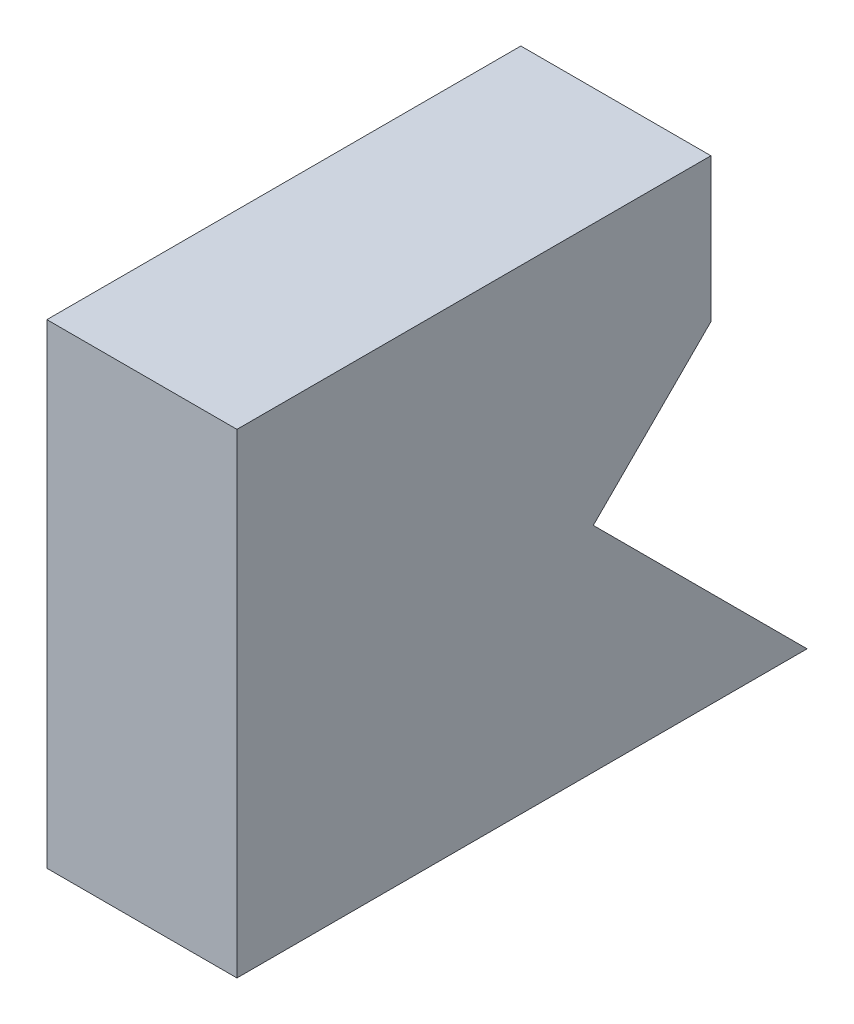
ISO-10303-21;
HEADER;
FILE_DESCRIPTION(('STEP AP214'),'2;1');
FILE_NAME('part.step','',(''),(''),'','','');
FILE_SCHEMA(('AUTOMOTIVE_DESIGN { 1 0 10303 214 1 1 1 1 }'));
ENDSEC;
DATA;
#1=APPLICATION_CONTEXT('core data for automotive mechanical design processes');
#2=APPLICATION_PROTOCOL_DEFINITION('international standard','automotive_design',2000,#1);
#3=PRODUCT_CONTEXT('',#1,'mechanical');
#4=PRODUCT('Part','Part','',(#3));
#5=PRODUCT_RELATED_PRODUCT_CATEGORY('part','',(#4));
#6=PRODUCT_DEFINITION_FORMATION('','',#4);
#7=PRODUCT_DEFINITION_CONTEXT('part definition',#1,'design');
#8=PRODUCT_DEFINITION('design','',#6,#7);
#9=PRODUCT_DEFINITION_SHAPE('','',#8);
#10=(LENGTH_UNIT() NAMED_UNIT(*) SI_UNIT(.MILLI.,.METRE.));
#11=(NAMED_UNIT(*) PLANE_ANGLE_UNIT() SI_UNIT($,.RADIAN.));
#12=(NAMED_UNIT(*) SI_UNIT($,.STERADIAN.) SOLID_ANGLE_UNIT());
#13=UNCERTAINTY_MEASURE_WITH_UNIT(LENGTH_MEASURE(1.E-05),#10,'distance_accuracy_value','');
#14=(GEOMETRIC_REPRESENTATION_CONTEXT(3) GLOBAL_UNCERTAINTY_ASSIGNED_CONTEXT((#13)) GLOBAL_UNIT_ASSIGNED_CONTEXT((#10,
#11,#12)) REPRESENTATION_CONTEXT('',''));
#15=CARTESIAN_POINT('',(0.,0.,0.));
#16=DIRECTION('',(0.,0.,1.));
#17=DIRECTION('',(1.,0.,0.));
#18=AXIS2_PLACEMENT_3D('',#15,#16,#17);
#19=CARTESIAN_POINT('',(40.,44.9999999999995,45.));
#20=DIRECTION('',(0.,-0.707106781186551,0.707106781186544));
#21=DIRECTION('',(0.,-0.707106781186544,-0.707106781186551));
#22=AXIS2_PLACEMENT_3D('',#19,#20,#21);
#23=PLANE('',#22);
#24=DIRECTION('',(0.,0.707106781186543,0.707106781186551));
#25=VECTOR('',#24,1.);
#26=CARTESIAN_POINT('',(0.,44.9999999999995,45.));
#27=LINE('',#26,#25);
#28=CARTESIAN_POINT('',(0.,0.,0.));
#29=VERTEX_POINT('',#28);
#30=CARTESIAN_POINT('',(0.,44.9999999999995,45.));
#31=VERTEX_POINT('',#30);
#32=EDGE_CURVE('E117',#29,#31,#27,.T.);
#33=ORIENTED_EDGE('',*,*,#32,.T.);
#34=DIRECTION('',(-1.,0.,0.));
#35=VECTOR('',#34,1.);
#36=CARTESIAN_POINT('',(40.,44.9999999999995,45.));
#37=LINE('',#36,#35);
#38=CARTESIAN_POINT('',(40.,44.9999999999995,45.));
#39=VERTEX_POINT('',#38);
#40=EDGE_CURVE('E11',#39,#31,#37,.T.);
#41=ORIENTED_EDGE('',*,*,#40,.F.);
#42=DIRECTION('',(0.,0.707106781186543,0.707106781186551));
#43=VECTOR('',#42,1.);
#44=CARTESIAN_POINT('',(40.,44.9999999999995,45.));
#45=LINE('',#44,#43);
#46=CARTESIAN_POINT('',(40.,0.,0.));
#47=VERTEX_POINT('',#46);
#48=EDGE_CURVE('E127',#47,#39,#45,.T.);
#49=ORIENTED_EDGE('',*,*,#48,.F.);
#50=DIRECTION('',(-1.,0.,0.));
#51=VECTOR('',#50,1.);
#52=CARTESIAN_POINT('',(40.,0.,0.));
#53=LINE('',#52,#51);
#54=EDGE_CURVE('E113',#47,#29,#53,.T.);
#55=ORIENTED_EDGE('',*,*,#54,.T.);
#56=EDGE_LOOP('',(#33,#41,#49,#55));
#57=FACE_BOUND('',#56,.T.);
#58=ADVANCED_FACE('F33',(#57),#23,.F.);
#59=CARTESIAN_POINT('',(40.,69.7487373415288,20.251262658471));
#60=DIRECTION('',(0.,0.707106781186544,0.707106781186551));
#61=DIRECTION('',(0.,-0.707106781186551,0.707106781186544));
#62=AXIS2_PLACEMENT_3D('',#59,#60,#61);
#63=PLANE('',#62);
#64=DIRECTION('',(0.,0.707106781186551,-0.707106781186544));
#65=VECTOR('',#64,1.);
#66=CARTESIAN_POINT('',(0.,69.7487373415288,20.251262658471));
#67=LINE('',#66,#65);
#68=CARTESIAN_POINT('',(0.,69.7487373415288,20.251262658471));
#69=VERTEX_POINT('',#68);
#70=EDGE_CURVE('E120',#31,#69,#67,.T.);
#71=ORIENTED_EDGE('',*,*,#70,.T.);
#72=DIRECTION('',(-1.,0.,0.));
#73=VECTOR('',#72,1.);
#74=CARTESIAN_POINT('',(40.,69.7487373415288,20.251262658471));
#75=LINE('',#74,#73);
#76=CARTESIAN_POINT('',(40.,69.7487373415288,20.251262658471));
#77=VERTEX_POINT('',#76);
#78=EDGE_CURVE('E41',#77,#69,#75,.T.);
#79=ORIENTED_EDGE('',*,*,#78,.F.);
#80=DIRECTION('',(0.,0.707106781186551,-0.707106781186544));
#81=VECTOR('',#80,1.);
#82=CARTESIAN_POINT('',(40.,69.7487373415288,20.251262658471));
#83=LINE('',#82,#81);
#84=EDGE_CURVE('E86',#39,#77,#83,.T.);
#85=ORIENTED_EDGE('',*,*,#84,.F.);
#86=ORIENTED_EDGE('',*,*,#40,.T.);
#87=EDGE_LOOP('',(#71,#79,#85,#86));
#88=FACE_BOUND('',#87,.T.);
#89=ADVANCED_FACE('F151',(#88),#63,.F.);
#90=CARTESIAN_POINT('',(40.,100.,20.251262658471));
#91=DIRECTION('',(0.,0.,1.));
#92=DIRECTION('',(0.,-1.,0.));
#93=AXIS2_PLACEMENT_3D('',#90,#91,#92);
#94=PLANE('',#93);
#95=DIRECTION('',(0.,1.,0.));
#96=VECTOR('',#95,1.);
#97=CARTESIAN_POINT('',(0.,100.,20.251262658471));
#98=LINE('',#97,#96);
#99=CARTESIAN_POINT('',(0.,100.,20.251262658471));
#100=VERTEX_POINT('',#99);
#101=EDGE_CURVE('E122',#69,#100,#98,.T.);
#102=ORIENTED_EDGE('',*,*,#101,.T.);
#103=DIRECTION('',(-1.,0.,0.));
#104=VECTOR('',#103,1.);
#105=CARTESIAN_POINT('',(40.,100.,20.251262658471));
#106=LINE('',#105,#104);
#107=CARTESIAN_POINT('',(40.,100.,20.251262658471));
#108=VERTEX_POINT('',#107);
#109=EDGE_CURVE('E108',#108,#100,#106,.T.);
#110=ORIENTED_EDGE('',*,*,#109,.F.);
#111=DIRECTION('',(0.,1.,0.));
#112=VECTOR('',#111,1.);
#113=CARTESIAN_POINT('',(40.,100.,20.251262658471));
#114=LINE('',#113,#112);
#115=EDGE_CURVE('E99',#77,#108,#114,.T.);
#116=ORIENTED_EDGE('',*,*,#115,.F.);
#117=ORIENTED_EDGE('',*,*,#78,.T.);
#118=EDGE_LOOP('',(#102,#110,#116,#117));
#119=FACE_BOUND('',#118,.T.);
#120=ADVANCED_FACE('F133',(#119),#94,.F.);
#121=CARTESIAN_POINT('',(40.,100.,120.));
#122=DIRECTION('',(0.,-1.,0.));
#123=DIRECTION('',(0.,0.,-1.));
#124=AXIS2_PLACEMENT_3D('',#121,#122,#123);
#125=PLANE('',#124);
#126=DIRECTION('',(0.,0.,1.));
#127=VECTOR('',#126,1.);
#128=CARTESIAN_POINT('',(0.,100.,120.));
#129=LINE('',#128,#127);
#130=CARTESIAN_POINT('',(0.,100.,120.));
#131=VERTEX_POINT('',#130);
#132=EDGE_CURVE('E107',#100,#131,#129,.T.);
#133=ORIENTED_EDGE('',*,*,#132,.T.);
#134=DIRECTION('',(-1.,0.,0.));
#135=VECTOR('',#134,1.);
#136=CARTESIAN_POINT('',(40.,100.,120.));
#137=LINE('',#136,#135);
#138=CARTESIAN_POINT('',(40.,100.,120.));
#139=VERTEX_POINT('',#138);
#140=EDGE_CURVE('E104',#139,#131,#137,.T.);
#141=ORIENTED_EDGE('',*,*,#140,.F.);
#142=DIRECTION('',(0.,0.,1.));
#143=VECTOR('',#142,1.);
#144=CARTESIAN_POINT('',(40.,100.,120.));
#145=LINE('',#144,#143);
#146=EDGE_CURVE('E93',#108,#139,#145,.T.);
#147=ORIENTED_EDGE('',*,*,#146,.F.);
#148=ORIENTED_EDGE('',*,*,#109,.T.);
#149=EDGE_LOOP('',(#133,#141,#147,#148));
#150=FACE_BOUND('',#149,.T.);
#151=ADVANCED_FACE('F105',(#150),#125,.F.);
#152=CARTESIAN_POINT('',(40.,0.,120.));
#153=DIRECTION('',(0.,0.,-1.));
#154=DIRECTION('',(-1.,0.,0.));
#155=AXIS2_PLACEMENT_3D('',#152,#153,#154);
#156=PLANE('',#155);
#157=DIRECTION('',(0.,-1.,0.));
#158=VECTOR('',#157,1.);
#159=CARTESIAN_POINT('',(0.,0.,120.));
#160=LINE('',#159,#158);
#161=CARTESIAN_POINT('',(0.,0.,120.));
#162=VERTEX_POINT('',#161);
#163=EDGE_CURVE('E72',#131,#162,#160,.T.);
#164=ORIENTED_EDGE('',*,*,#163,.T.);
#165=DIRECTION('',(-1.,0.,0.));
#166=VECTOR('',#165,1.);
#167=CARTESIAN_POINT('',(40.,0.,120.));
#168=LINE('',#167,#166);
#169=CARTESIAN_POINT('',(40.,0.,120.));
#170=VERTEX_POINT('',#169);
#171=EDGE_CURVE('E109',#170,#162,#168,.T.);
#172=ORIENTED_EDGE('',*,*,#171,.F.);
#173=DIRECTION('',(0.,-1.,0.));
#174=VECTOR('',#173,1.);
#175=CARTESIAN_POINT('',(40.,0.,120.));
#176=LINE('',#175,#174);
#177=EDGE_CURVE('E97',#139,#170,#176,.T.);
#178=ORIENTED_EDGE('',*,*,#177,.F.);
#179=ORIENTED_EDGE('',*,*,#140,.T.);
#180=EDGE_LOOP('',(#164,#172,#178,#179));
#181=FACE_BOUND('',#180,.T.);
#182=ADVANCED_FACE('F111',(#181),#156,.F.);
#183=CARTESIAN_POINT('',(40.,0.,0.));
#184=DIRECTION('',(0.,1.,0.));
#185=DIRECTION('',(0.,0.,1.));
#186=AXIS2_PLACEMENT_3D('',#183,#184,#185);
#187=PLANE('',#186);
#188=DIRECTION('',(0.,0.,-1.));
#189=VECTOR('',#188,1.);
#190=CARTESIAN_POINT('',(0.,0.,0.));
#191=LINE('',#190,#189);
#192=EDGE_CURVE('E78',#162,#29,#191,.T.);
#193=ORIENTED_EDGE('',*,*,#192,.T.);
#194=ORIENTED_EDGE('',*,*,#54,.F.);
#195=DIRECTION('',(0.,0.,-1.));
#196=VECTOR('',#195,1.);
#197=CARTESIAN_POINT('',(40.,0.,0.));
#198=LINE('',#197,#196);
#199=EDGE_CURVE('E49',#170,#47,#198,.T.);
#200=ORIENTED_EDGE('',*,*,#199,.F.);
#201=ORIENTED_EDGE('',*,*,#171,.T.);
#202=EDGE_LOOP('',(#193,#194,#200,#201));
#203=FACE_BOUND('',#202,.T.);
#204=ADVANCED_FACE('F140',(#203),#187,.F.);
#205=CARTESIAN_POINT('',(40.,0.,0.));
#206=DIRECTION('',(-1.,0.,0.));
#207=DIRECTION('',(0.,0.,1.));
#208=AXIS2_PLACEMENT_3D('',#205,#206,#207);
#209=PLANE('',#208);
#210=ORIENTED_EDGE('',*,*,#48,.T.);
#211=ORIENTED_EDGE('',*,*,#84,.T.);
#212=ORIENTED_EDGE('',*,*,#115,.T.);
#213=ORIENTED_EDGE('',*,*,#146,.T.);
#214=ORIENTED_EDGE('',*,*,#177,.T.);
#215=ORIENTED_EDGE('',*,*,#199,.T.);
#216=EDGE_LOOP('',(#210,#211,#212,#213,#214,#215));
#217=FACE_BOUND('',#216,.T.);
#218=ADVANCED_FACE('F95',(#217),#209,.F.);
#219=CARTESIAN_POINT('',(0.,0.,0.));
#220=DIRECTION('',(-1.,0.,0.));
#221=DIRECTION('',(0.,0.,1.));
#222=AXIS2_PLACEMENT_3D('',#219,#220,#221);
#223=PLANE('',#222);
#224=ORIENTED_EDGE('',*,*,#32,.F.);
#225=ORIENTED_EDGE('',*,*,#192,.F.);
#226=ORIENTED_EDGE('',*,*,#163,.F.);
#227=ORIENTED_EDGE('',*,*,#132,.F.);
#228=ORIENTED_EDGE('',*,*,#101,.F.);
#229=ORIENTED_EDGE('',*,*,#70,.F.);
#230=EDGE_LOOP('',(#224,#225,#226,#227,#228,#229));
#231=FACE_BOUND('',#230,.T.);
#232=ADVANCED_FACE('F136',(#231),#223,.T.);
#233=CLOSED_SHELL('',(#58,#89,#120,#151,#182,#204,#218,#232));
#234=MANIFOLD_SOLID_BREP('B2',#233);
#235=ADVANCED_BREP_SHAPE_REPRESENTATION('',(#18,#234),#14);
#236=SHAPE_DEFINITION_REPRESENTATION(#9,#235);
ENDSEC;
END-ISO-10303-21;
